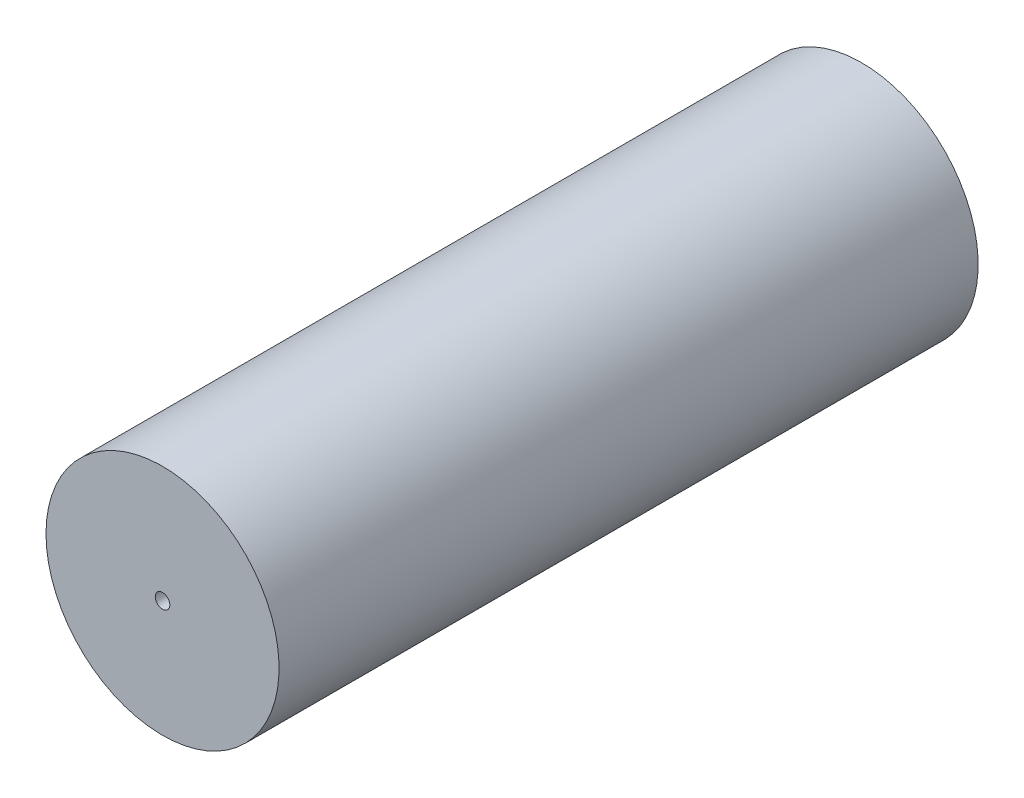
ISO-10303-21;
HEADER;
FILE_DESCRIPTION(('STEP AP214'),'2;1');
FILE_NAME('part.step','',(''),(''),'','','');
FILE_SCHEMA(('AUTOMOTIVE_DESIGN { 1 0 10303 214 1 1 1 1 }'));
ENDSEC;
DATA;
#1=APPLICATION_CONTEXT('core data for automotive mechanical design processes');
#2=APPLICATION_PROTOCOL_DEFINITION('international standard','automotive_design',2000,#1);
#3=PRODUCT_CONTEXT('',#1,'mechanical');
#4=PRODUCT('Part','Part','',(#3));
#5=PRODUCT_RELATED_PRODUCT_CATEGORY('part','',(#4));
#6=PRODUCT_DEFINITION_FORMATION('','',#4);
#7=PRODUCT_DEFINITION_CONTEXT('part definition',#1,'design');
#8=PRODUCT_DEFINITION('design','',#6,#7);
#9=PRODUCT_DEFINITION_SHAPE('','',#8);
#10=(LENGTH_UNIT() NAMED_UNIT(*) SI_UNIT(.MILLI.,.METRE.));
#11=(NAMED_UNIT(*) PLANE_ANGLE_UNIT() SI_UNIT($,.RADIAN.));
#12=(NAMED_UNIT(*) SI_UNIT($,.STERADIAN.) SOLID_ANGLE_UNIT());
#13=UNCERTAINTY_MEASURE_WITH_UNIT(LENGTH_MEASURE(1.E-05),#10,'distance_accuracy_value','');
#14=(GEOMETRIC_REPRESENTATION_CONTEXT(3) GLOBAL_UNCERTAINTY_ASSIGNED_CONTEXT((#13)) GLOBAL_UNIT_ASSIGNED_CONTEXT((#10,
#11,#12)) REPRESENTATION_CONTEXT('',''));
#15=CARTESIAN_POINT('',(0.,0.,0.));
#16=DIRECTION('',(0.,0.,1.));
#17=DIRECTION('',(1.,0.,0.));
#18=AXIS2_PLACEMENT_3D('',#15,#16,#17);
#19=CARTESIAN_POINT('',(0.,0.,76.2));
#20=DIRECTION('',(0.,0.,-1.));
#21=DIRECTION('',(-1.,0.,0.));
#22=AXIS2_PLACEMENT_3D('',#19,#20,#21);
#23=CYLINDRICAL_SURFACE('',#22,12.7);
#24=CARTESIAN_POINT('',(0.,0.,76.2));
#25=DIRECTION('',(0.,0.,1.));
#26=DIRECTION('',(1.,0.,0.));
#27=AXIS2_PLACEMENT_3D('',#24,#25,#26);
#28=CIRCLE('',#27,12.7);
#29=CARTESIAN_POINT('',(-12.7,0.,76.2));
#30=VERTEX_POINT('',#29);
#31=EDGE_CURVE('E10',#30,#30,#28,.T.);
#32=CARTESIAN_POINT('',(0.,0.,0.));
#33=DIRECTION('',(0.,0.,1.));
#34=DIRECTION('',(1.,0.,0.));
#35=AXIS2_PLACEMENT_3D('',#32,#33,#34);
#36=CIRCLE('',#35,12.7);
#37=CARTESIAN_POINT('',(-12.7,0.,0.));
#38=VERTEX_POINT('',#37);
#39=EDGE_CURVE('E34',#38,#38,#36,.T.);
#40=CARTESIAN_POINT('',(-12.7,0.,76.2));
#41=CARTESIAN_POINT('',(-12.7,0.,75.40625));
#42=CARTESIAN_POINT('',(-12.7,0.,74.6125));
#43=CARTESIAN_POINT('',(-12.7,0.,73.025));
#44=CARTESIAN_POINT('',(-12.7,0.,72.23125));
#45=CARTESIAN_POINT('',(-12.7,0.,70.64375));
#46=CARTESIAN_POINT('',(-12.7,0.,69.85));
#47=CARTESIAN_POINT('',(-12.7,0.,68.2625));
#48=CARTESIAN_POINT('',(-12.7,0.,67.46875));
#49=CARTESIAN_POINT('',(-12.7,0.,65.88125));
#50=CARTESIAN_POINT('',(-12.7,0.,65.0875));
#51=CARTESIAN_POINT('',(-12.7,0.,63.5));
#52=CARTESIAN_POINT('',(-12.7,0.,62.70625));
#53=CARTESIAN_POINT('',(-12.7,0.,61.11875));
#54=CARTESIAN_POINT('',(-12.7,0.,60.325));
#55=CARTESIAN_POINT('',(-12.7,0.,58.7375));
#56=CARTESIAN_POINT('',(-12.7,0.,57.94375));
#57=CARTESIAN_POINT('',(-12.7,0.,56.35625));
#58=CARTESIAN_POINT('',(-12.7,0.,55.5625));
#59=CARTESIAN_POINT('',(-12.7,0.,53.975));
#60=CARTESIAN_POINT('',(-12.7,0.,53.18125));
#61=CARTESIAN_POINT('',(-12.7,0.,51.59375));
#62=CARTESIAN_POINT('',(-12.7,0.,50.8));
#63=CARTESIAN_POINT('',(-12.7,0.,49.2125));
#64=CARTESIAN_POINT('',(-12.7,0.,48.41875));
#65=CARTESIAN_POINT('',(-12.7,0.,46.83125));
#66=CARTESIAN_POINT('',(-12.7,0.,46.0375));
#67=CARTESIAN_POINT('',(-12.7,0.,44.45));
#68=CARTESIAN_POINT('',(-12.7,0.,43.65625));
#69=CARTESIAN_POINT('',(-12.7,0.,42.06875));
#70=CARTESIAN_POINT('',(-12.7,0.,41.275));
#71=CARTESIAN_POINT('',(-12.7,0.,39.6875));
#72=CARTESIAN_POINT('',(-12.7,0.,38.89375));
#73=CARTESIAN_POINT('',(-12.7,0.,37.30625));
#74=CARTESIAN_POINT('',(-12.7,0.,36.5125));
#75=CARTESIAN_POINT('',(-12.7,0.,34.925));
#76=CARTESIAN_POINT('',(-12.7,0.,34.13125));
#77=CARTESIAN_POINT('',(-12.7,0.,32.54375));
#78=CARTESIAN_POINT('',(-12.7,0.,31.75));
#79=CARTESIAN_POINT('',(-12.7,0.,30.1625));
#80=CARTESIAN_POINT('',(-12.7,0.,29.36875));
#81=CARTESIAN_POINT('',(-12.7,0.,27.78125));
#82=CARTESIAN_POINT('',(-12.7,0.,26.9875));
#83=CARTESIAN_POINT('',(-12.7,0.,25.4));
#84=CARTESIAN_POINT('',(-12.7,0.,24.60625));
#85=CARTESIAN_POINT('',(-12.7,0.,23.01875));
#86=CARTESIAN_POINT('',(-12.7,0.,22.225));
#87=CARTESIAN_POINT('',(-12.7,0.,20.6375));
#88=CARTESIAN_POINT('',(-12.7,0.,19.84375));
#89=CARTESIAN_POINT('',(-12.7,0.,18.25625));
#90=CARTESIAN_POINT('',(-12.7,0.,17.4625));
#91=CARTESIAN_POINT('',(-12.7,0.,15.875));
#92=CARTESIAN_POINT('',(-12.7,0.,15.08125));
#93=CARTESIAN_POINT('',(-12.7,0.,13.49375));
#94=CARTESIAN_POINT('',(-12.7,0.,12.7));
#95=CARTESIAN_POINT('',(-12.7,0.,11.1125));
#96=CARTESIAN_POINT('',(-12.7,0.,10.31875));
#97=CARTESIAN_POINT('',(-12.7,0.,8.73125));
#98=CARTESIAN_POINT('',(-12.7,0.,7.93750000000001));
#99=CARTESIAN_POINT('',(-12.7,0.,6.35));
#100=CARTESIAN_POINT('',(-12.7,0.,5.55625));
#101=CARTESIAN_POINT('',(-12.7,0.,3.96875));
#102=CARTESIAN_POINT('',(-12.7,0.,3.175));
#103=CARTESIAN_POINT('',(-12.7,0.,1.5875));
#104=CARTESIAN_POINT('',(-12.7,0.,0.793750000000001));
#105=CARTESIAN_POINT('',(-12.7,0.,0.));
#106=B_SPLINE_CURVE_WITH_KNOTS('',3,(#40,#41,#42,#43,#44,#45,#46,#47,#48,#49,#50,#51,#52,#53,
#54,#55,#56,#57,#58,#59,#60,#61,#62,#63,#64,#65,#66,#67,#68,#69,#70,#71,#72,#73,#74,#75,#76,#77,
#78,#79,#80,#81,#82,#83,#84,#85,#86,#87,#88,#89,#90,#91,#92,#93,#94,#95,#96,#97,#98,#99,#100,
#101,#102,#103,#104,#105),.UNSPECIFIED.,.F.,.F.,(4,2,2,2,2,2,2,2,2,2,2,2,2,2,2,2,2,2,2,2,2,2,2,
2,2,2,2,2,2,2,2,2,4),(0.,2.38124999999999,4.76249999999999,7.14374999999999,9.52499999999999,
11.90625,14.2875,16.66875,19.05,21.43125,23.8125,26.19375,28.575,30.95625,33.3375,35.71875,38.1,
40.48125,42.8625,45.24375,47.625,50.00625,52.3875,54.76875,57.15,59.53125,61.9125,64.29375,
66.675,69.05625,71.4375,73.81875,76.2),.UNSPECIFIED.);
#107=EDGE_CURVE('BSEAM31',#30,#38,#106,.T.);
#108=ORIENTED_EDGE('',*,*,#31,.F.);
#109=ORIENTED_EDGE('',*,*,#39,.T.);
#110=ORIENTED_EDGE('',*,*,#107,.T.);
#111=ORIENTED_EDGE('',*,*,#107,.F.);
#112=EDGE_LOOP('',(#108,#110,#109,#111));
#113=FACE_BOUND('',#112,.T.);
#114=ADVANCED_FACE('F31',(#113),#23,.T.);
#115=CARTESIAN_POINT('',(0.,0.,76.2));
#116=DIRECTION('',(0.,0.,1.));
#117=DIRECTION('',(1.,0.,0.));
#118=AXIS2_PLACEMENT_3D('',#115,#116,#117);
#119=PLANE('',#118);
#120=CARTESIAN_POINT('',(0.,0.,76.2));
#121=DIRECTION('',(0.,0.,1.));
#122=DIRECTION('',(1.,0.,0.));
#123=AXIS2_PLACEMENT_3D('',#120,#121,#122);
#124=CIRCLE('',#123,0.79375);
#125=CARTESIAN_POINT('',(0.79375,0.,76.2));
#126=VERTEX_POINT('',#125);
#127=EDGE_CURVE('E43',#126,#126,#124,.T.);
#128=ORIENTED_EDGE('',*,*,#127,.F.);
#129=EDGE_LOOP('',(#128));
#130=FACE_BOUND('',#129,.T.);
#131=ORIENTED_EDGE('',*,*,#31,.T.);
#132=EDGE_LOOP('',(#131));
#133=FACE_BOUND('',#132,.T.);
#134=ADVANCED_FACE('F58',(#130,#133),#119,.T.);
#135=CARTESIAN_POINT('',(0.,0.,0.));
#136=DIRECTION('',(0.,0.,1.));
#137=DIRECTION('',(1.,0.,0.));
#138=AXIS2_PLACEMENT_3D('',#135,#136,#137);
#139=PLANE('',#138);
#140=CARTESIAN_POINT('',(0.,0.,0.));
#141=DIRECTION('',(0.,0.,1.));
#142=DIRECTION('',(1.,0.,0.));
#143=AXIS2_PLACEMENT_3D('',#140,#141,#142);
#144=CIRCLE('',#143,0.79375);
#145=CARTESIAN_POINT('',(0.79375,0.,0.));
#146=VERTEX_POINT('',#145);
#147=EDGE_CURVE('E41',#146,#146,#144,.T.);
#148=ORIENTED_EDGE('',*,*,#147,.T.);
#149=EDGE_LOOP('',(#148));
#150=FACE_BOUND('',#149,.T.);
#151=ORIENTED_EDGE('',*,*,#39,.F.);
#152=EDGE_LOOP('',(#151));
#153=FACE_BOUND('',#152,.T.);
#154=ADVANCED_FACE('F49',(#150,#153),#139,.F.);
#155=CARTESIAN_POINT('',(0.,0.,0.));
#156=DIRECTION('',(0.,0.,1.));
#157=DIRECTION('',(1.,0.,0.));
#158=AXIS2_PLACEMENT_3D('',#155,#156,#157);
#159=CYLINDRICAL_SURFACE('',#158,0.79375);
#160=CARTESIAN_POINT('',(0.79375,0.,0.));
#161=CARTESIAN_POINT('',(0.79375,0.,0.79375));
#162=CARTESIAN_POINT('',(0.79375,0.,1.5875));
#163=CARTESIAN_POINT('',(0.79375,0.,3.175));
#164=CARTESIAN_POINT('',(0.79375,0.,3.96875));
#165=CARTESIAN_POINT('',(0.79375,0.,5.55625));
#166=CARTESIAN_POINT('',(0.79375,0.,6.35));
#167=CARTESIAN_POINT('',(0.79375,0.,7.9375));
#168=CARTESIAN_POINT('',(0.79375,0.,8.73125));
#169=CARTESIAN_POINT('',(0.79375,0.,10.31875));
#170=CARTESIAN_POINT('',(0.79375,0.,11.1125));
#171=CARTESIAN_POINT('',(0.79375,0.,12.7));
#172=CARTESIAN_POINT('',(0.79375,0.,13.49375));
#173=CARTESIAN_POINT('',(0.79375,0.,15.08125));
#174=CARTESIAN_POINT('',(0.79375,0.,15.875));
#175=CARTESIAN_POINT('',(0.79375,0.,17.4625));
#176=CARTESIAN_POINT('',(0.79375,0.,18.25625));
#177=CARTESIAN_POINT('',(0.79375,0.,19.84375));
#178=CARTESIAN_POINT('',(0.79375,0.,20.6375));
#179=CARTESIAN_POINT('',(0.79375,0.,22.225));
#180=CARTESIAN_POINT('',(0.79375,0.,23.01875));
#181=CARTESIAN_POINT('',(0.79375,0.,24.60625));
#182=CARTESIAN_POINT('',(0.79375,0.,25.4));
#183=CARTESIAN_POINT('',(0.79375,0.,26.9875));
#184=CARTESIAN_POINT('',(0.79375,0.,27.78125));
#185=CARTESIAN_POINT('',(0.79375,0.,29.36875));
#186=CARTESIAN_POINT('',(0.79375,0.,30.1625));
#187=CARTESIAN_POINT('',(0.79375,0.,31.75));
#188=CARTESIAN_POINT('',(0.79375,0.,32.54375));
#189=CARTESIAN_POINT('',(0.79375,0.,34.13125));
#190=CARTESIAN_POINT('',(0.79375,0.,34.925));
#191=CARTESIAN_POINT('',(0.79375,0.,36.5125));
#192=CARTESIAN_POINT('',(0.79375,0.,37.30625));
#193=CARTESIAN_POINT('',(0.79375,0.,38.89375));
#194=CARTESIAN_POINT('',(0.79375,0.,39.6875));
#195=CARTESIAN_POINT('',(0.79375,0.,41.275));
#196=CARTESIAN_POINT('',(0.79375,0.,42.06875));
#197=CARTESIAN_POINT('',(0.79375,0.,43.65625));
#198=CARTESIAN_POINT('',(0.79375,0.,44.45));
#199=CARTESIAN_POINT('',(0.79375,0.,46.0375));
#200=CARTESIAN_POINT('',(0.79375,0.,46.83125));
#201=CARTESIAN_POINT('',(0.79375,0.,48.41875));
#202=CARTESIAN_POINT('',(0.79375,0.,49.2125));
#203=CARTESIAN_POINT('',(0.79375,0.,50.8));
#204=CARTESIAN_POINT('',(0.79375,0.,51.59375));
#205=CARTESIAN_POINT('',(0.79375,0.,53.18125));
#206=CARTESIAN_POINT('',(0.79375,0.,53.975));
#207=CARTESIAN_POINT('',(0.79375,0.,55.5625));
#208=CARTESIAN_POINT('',(0.79375,0.,56.35625));
#209=CARTESIAN_POINT('',(0.79375,0.,57.94375));
#210=CARTESIAN_POINT('',(0.79375,0.,58.7375));
#211=CARTESIAN_POINT('',(0.79375,0.,60.325));
#212=CARTESIAN_POINT('',(0.79375,0.,61.11875));
#213=CARTESIAN_POINT('',(0.79375,0.,62.70625));
#214=CARTESIAN_POINT('',(0.79375,0.,63.5));
#215=CARTESIAN_POINT('',(0.79375,0.,65.0875));
#216=CARTESIAN_POINT('',(0.79375,0.,65.88125));
#217=CARTESIAN_POINT('',(0.79375,0.,67.46875));
#218=CARTESIAN_POINT('',(0.79375,0.,68.2625));
#219=CARTESIAN_POINT('',(0.79375,0.,69.85));
#220=CARTESIAN_POINT('',(0.79375,0.,70.64375));
#221=CARTESIAN_POINT('',(0.79375,0.,72.23125));
#222=CARTESIAN_POINT('',(0.79375,0.,73.025));
#223=CARTESIAN_POINT('',(0.79375,0.,74.6125));
#224=CARTESIAN_POINT('',(0.79375,0.,75.40625));
#225=CARTESIAN_POINT('',(0.79375,0.,76.2));
#226=B_SPLINE_CURVE_WITH_KNOTS('',3,(#160,#161,#162,#163,#164,#165,#166,#167,#168,#169,#170,
#171,#172,#173,#174,#175,#176,#177,#178,#179,#180,#181,#182,#183,#184,#185,#186,#187,#188,#189,
#190,#191,#192,#193,#194,#195,#196,#197,#198,#199,#200,#201,#202,#203,#204,#205,#206,#207,#208,
#209,#210,#211,#212,#213,#214,#215,#216,#217,#218,#219,#220,#221,#222,#223,#224,#225),
.UNSPECIFIED.,.F.,.F.,(4,2,2,2,2,2,2,2,2,2,2,2,2,2,2,2,2,2,2,2,2,2,2,2,2,2,2,2,2,2,2,2,4),(0.,
2.38125,4.7625,7.14375,9.525,11.90625,14.2875,16.66875,19.05,21.43125,23.8125,26.19375,28.575,
30.95625,33.3375,35.71875,38.1,40.48125,42.8625,45.24375,47.625,50.00625,52.3875,54.76875,57.15,
59.53125,61.9125,64.29375,66.675,69.05625,71.4375,73.81875,76.2),.UNSPECIFIED.);
#227=EDGE_CURVE('BSEAM52',#146,#126,#226,.T.);
#228=ORIENTED_EDGE('',*,*,#147,.F.);
#229=ORIENTED_EDGE('',*,*,#127,.T.);
#230=ORIENTED_EDGE('',*,*,#227,.T.);
#231=ORIENTED_EDGE('',*,*,#227,.F.);
#232=EDGE_LOOP('',(#228,#230,#229,#231));
#233=FACE_BOUND('',#232,.T.);
#234=ADVANCED_FACE('F52',(#233),#159,.F.);
#235=CLOSED_SHELL('',(#114,#134,#154,#234));
#236=MANIFOLD_SOLID_BREP('B2',#235);
#237=ADVANCED_BREP_SHAPE_REPRESENTATION('',(#18,#236),#14);
#238=SHAPE_DEFINITION_REPRESENTATION(#9,#237);
ENDSEC;
END-ISO-10303-21;
